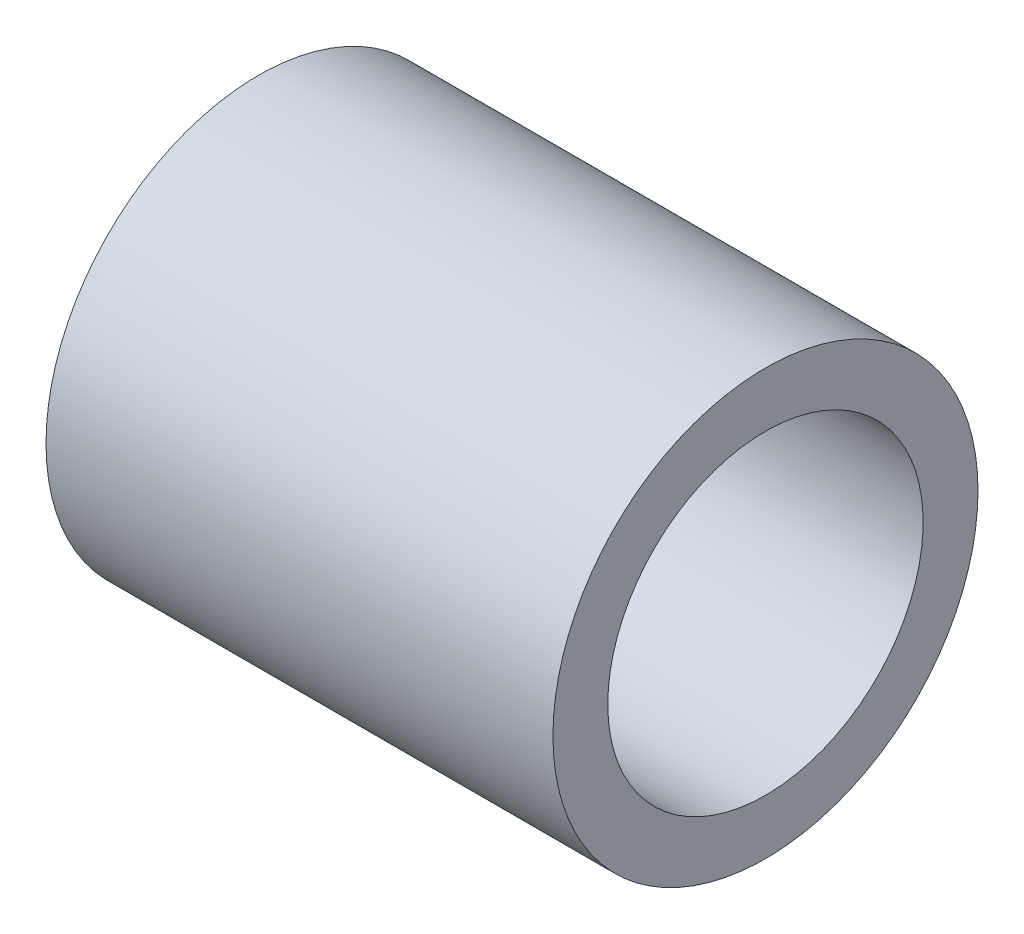
ISO-10303-21;
HEADER;
FILE_DESCRIPTION(('STEP AP214'),'2;1');
FILE_NAME('part.step','',(''),(''),'','','');
FILE_SCHEMA(('AUTOMOTIVE_DESIGN { 1 0 10303 214 1 1 1 1 }'));
ENDSEC;
DATA;
#1=APPLICATION_CONTEXT('core data for automotive mechanical design processes');
#2=APPLICATION_PROTOCOL_DEFINITION('international standard','automotive_design',2000,#1);
#3=PRODUCT_CONTEXT('',#1,'mechanical');
#4=PRODUCT('Part','Part','',(#3));
#5=PRODUCT_RELATED_PRODUCT_CATEGORY('part','',(#4));
#6=PRODUCT_DEFINITION_FORMATION('','',#4);
#7=PRODUCT_DEFINITION_CONTEXT('part definition',#1,'design');
#8=PRODUCT_DEFINITION('design','',#6,#7);
#9=PRODUCT_DEFINITION_SHAPE('','',#8);
#10=(LENGTH_UNIT() NAMED_UNIT(*) SI_UNIT(.MILLI.,.METRE.));
#11=(NAMED_UNIT(*) PLANE_ANGLE_UNIT() SI_UNIT($,.RADIAN.));
#12=(NAMED_UNIT(*) SI_UNIT($,.STERADIAN.) SOLID_ANGLE_UNIT());
#13=UNCERTAINTY_MEASURE_WITH_UNIT(LENGTH_MEASURE(1.E-05),#10,'distance_accuracy_value','');
#14=(GEOMETRIC_REPRESENTATION_CONTEXT(3) GLOBAL_UNCERTAINTY_ASSIGNED_CONTEXT((#13)) GLOBAL_UNIT_ASSIGNED_CONTEXT((#10,
#11,#12)) REPRESENTATION_CONTEXT('',''));
#15=CARTESIAN_POINT('',(0.,0.,0.));
#16=DIRECTION('',(0.,0.,1.));
#17=DIRECTION('',(1.,0.,0.));
#18=AXIS2_PLACEMENT_3D('',#15,#16,#17);
#19=CARTESIAN_POINT('',(25.4,-3.88578058618805E-13,-2.22044604925031E-13));
#20=DIRECTION('',(0.999999999999997,0.,0.));
#21=DIRECTION('',(0.,0.,-0.99999999999999));
#22=AXIS2_PLACEMENT_3D('',#19,#20,#21);
#23=PLANE('',#22);
#24=CARTESIAN_POINT('',(25.4,-3.88578058618805E-13,-2.22044604925031E-13));
#25=DIRECTION('',(0.999999999999997,0.,0.));
#26=DIRECTION('',(0.,0.,-0.99999999999999));
#27=AXIS2_PLACEMENT_3D('',#24,#25,#26);
#28=CIRCLE('',#27,10.65);
#29=CARTESIAN_POINT('',(25.4,-3.88578058618805E-13,10.6499999999997));
#30=VERTEX_POINT('',#29);
#31=EDGE_CURVE('E10',#30,#30,#28,.T.);
#32=ORIENTED_EDGE('',*,*,#31,.T.);
#33=EDGE_LOOP('',(#32));
#34=FACE_BOUND('',#33,.T.);
#35=CARTESIAN_POINT('',(25.4,-3.88578058618805E-13,-2.22044604925031E-13));
#36=DIRECTION('',(0.999999999999997,0.,0.));
#37=DIRECTION('',(0.,0.,-0.99999999999999));
#38=AXIS2_PLACEMENT_3D('',#35,#36,#37);
#39=CIRCLE('',#38,7.9);
#40=CARTESIAN_POINT('',(25.4,-3.88578058618805E-13,7.8999999999997));
#41=VERTEX_POINT('',#40);
#42=EDGE_CURVE('E39',#41,#41,#39,.T.);
#43=ORIENTED_EDGE('',*,*,#42,.F.);
#44=EDGE_LOOP('',(#43));
#45=FACE_BOUND('',#44,.T.);
#46=ADVANCED_FACE('F28',(#34,#45),#23,.T.);
#47=CARTESIAN_POINT('',(0.,0.,0.));
#48=DIRECTION('',(0.999999999999997,0.,0.));
#49=DIRECTION('',(0.,0.,-0.99999999999999));
#50=AXIS2_PLACEMENT_3D('',#47,#48,#49);
#51=PLANE('',#50);
#52=CARTESIAN_POINT('',(0.,0.,0.));
#53=DIRECTION('',(0.999999999999997,0.,0.));
#54=DIRECTION('',(0.,0.,-0.99999999999999));
#55=AXIS2_PLACEMENT_3D('',#52,#53,#54);
#56=CIRCLE('',#55,10.65);
#57=CARTESIAN_POINT('',(0.,-3.88578058618805E-13,10.6499999999997));
#58=VERTEX_POINT('',#57);
#59=EDGE_CURVE('E32',#58,#58,#56,.T.);
#60=ORIENTED_EDGE('',*,*,#59,.F.);
#61=EDGE_LOOP('',(#60));
#62=FACE_BOUND('',#61,.T.);
#63=CARTESIAN_POINT('',(0.,0.,0.));
#64=DIRECTION('',(0.999999999999997,0.,0.));
#65=DIRECTION('',(0.,0.,-0.99999999999999));
#66=AXIS2_PLACEMENT_3D('',#63,#64,#65);
#67=CIRCLE('',#66,7.9);
#68=CARTESIAN_POINT('',(0.,-3.88578058618805E-13,7.8999999999997));
#69=VERTEX_POINT('',#68);
#70=EDGE_CURVE('E41',#69,#69,#67,.T.);
#71=ORIENTED_EDGE('',*,*,#70,.T.);
#72=EDGE_LOOP('',(#71));
#73=FACE_BOUND('',#72,.T.);
#74=ADVANCED_FACE('F51',(#62,#73),#51,.F.);
#75=CARTESIAN_POINT('',(25.4,-3.88578058618805E-13,-2.22044604925031E-13));
#76=DIRECTION('',(-0.999999999999997,0.,0.));
#77=DIRECTION('',(0.,0.,0.99999999999999));
#78=AXIS2_PLACEMENT_3D('',#75,#76,#77);
#79=CYLINDRICAL_SURFACE('',#78,10.65);
#80=CARTESIAN_POINT('',(25.4,-3.88578058618805E-13,10.6499999999997));
#81=CARTESIAN_POINT('',(25.1354166666666,-3.88578058618805E-13,10.6499999999997));
#82=CARTESIAN_POINT('',(24.8708333333333,-3.88578058618805E-13,10.6499999999997));
#83=CARTESIAN_POINT('',(24.3416666666666,-3.88578058618805E-13,10.6499999999997));
#84=CARTESIAN_POINT('',(24.0770833333333,-3.88578058618805E-13,10.6499999999997));
#85=CARTESIAN_POINT('',(23.5479166666666,-3.88578058618805E-13,10.6499999999997));
#86=CARTESIAN_POINT('',(23.2833333333333,-3.88578058618805E-13,10.6499999999997));
#87=CARTESIAN_POINT('',(22.7541666666666,-3.88578058618805E-13,10.6499999999997));
#88=CARTESIAN_POINT('',(22.4895833333333,-3.88578058618805E-13,10.6499999999997));
#89=CARTESIAN_POINT('',(21.9604166666666,-3.88578058618805E-13,10.6499999999997));
#90=CARTESIAN_POINT('',(21.6958333333333,-3.88578058618805E-13,10.6499999999997));
#91=CARTESIAN_POINT('',(21.1666666666666,-3.88578058618805E-13,10.6499999999997));
#92=CARTESIAN_POINT('',(20.9020833333333,-3.88578058618805E-13,10.6499999999997));
#93=CARTESIAN_POINT('',(20.3729166666666,-3.88578058618805E-13,10.6499999999997));
#94=CARTESIAN_POINT('',(20.1083333333333,-3.88578058618805E-13,10.6499999999997));
#95=CARTESIAN_POINT('',(19.5791666666666,-3.88578058618805E-13,10.6499999999997));
#96=CARTESIAN_POINT('',(19.3145833333333,-3.88578058618805E-13,10.6499999999997));
#97=CARTESIAN_POINT('',(18.7854166666666,-3.88578058618805E-13,10.6499999999997));
#98=CARTESIAN_POINT('',(18.5208333333333,-3.88578058618805E-13,10.6499999999997));
#99=CARTESIAN_POINT('',(17.9916666666666,-3.88578058618805E-13,10.6499999999997));
#100=CARTESIAN_POINT('',(17.7270833333333,-3.88578058618805E-13,10.6499999999997));
#101=CARTESIAN_POINT('',(17.1979166666666,-3.88578058618805E-13,10.6499999999997));
#102=CARTESIAN_POINT('',(16.9333333333333,-3.88578058618805E-13,10.6499999999997));
#103=CARTESIAN_POINT('',(16.4041666666666,-3.88578058618805E-13,10.6499999999997));
#104=CARTESIAN_POINT('',(16.1395833333333,-3.88578058618805E-13,10.6499999999997));
#105=CARTESIAN_POINT('',(15.6104166666666,-3.88578058618805E-13,10.6499999999997));
#106=CARTESIAN_POINT('',(15.3458333333333,-3.88578058618805E-13,10.6499999999997));
#107=CARTESIAN_POINT('',(14.8166666666666,-3.88578058618805E-13,10.6499999999997));
#108=CARTESIAN_POINT('',(14.5520833333333,-3.88578058618805E-13,10.6499999999997));
#109=CARTESIAN_POINT('',(14.0229166666666,-3.88578058618805E-13,10.6499999999997));
#110=CARTESIAN_POINT('',(13.7583333333333,-3.88578058618805E-13,10.6499999999997));
#111=CARTESIAN_POINT('',(13.2291666666667,-3.88578058618805E-13,10.6499999999997));
#112=CARTESIAN_POINT('',(12.9645833333333,-3.88578058618805E-13,10.6499999999997));
#113=CARTESIAN_POINT('',(12.4354166666667,-3.88578058618805E-13,10.6499999999997));
#114=CARTESIAN_POINT('',(12.1708333333333,-3.88578058618805E-13,10.6499999999997));
#115=CARTESIAN_POINT('',(11.6416666666667,-3.88578058618805E-13,10.6499999999997));
#116=CARTESIAN_POINT('',(11.3770833333333,-3.88578058618805E-13,10.6499999999997));
#117=CARTESIAN_POINT('',(10.8479166666667,-3.88578058618805E-13,10.6499999999997));
#118=CARTESIAN_POINT('',(10.5833333333333,-3.88578058618805E-13,10.6499999999997));
#119=CARTESIAN_POINT('',(10.0541666666667,-3.88578058618805E-13,10.6499999999997));
#120=CARTESIAN_POINT('',(9.78958333333332,-3.88578058618805E-13,10.6499999999997));
#121=CARTESIAN_POINT('',(9.26041666666665,-3.88578058618805E-13,10.6499999999997));
#122=CARTESIAN_POINT('',(8.99583333333332,-3.88578058618805E-13,10.6499999999997));
#123=CARTESIAN_POINT('',(8.46666666666665,-3.88578058618805E-13,10.6499999999997));
#124=CARTESIAN_POINT('',(8.20208333333332,-3.88578058618805E-13,10.6499999999997));
#125=CARTESIAN_POINT('',(7.67291666666666,-3.88578058618805E-13,10.6499999999997));
#126=CARTESIAN_POINT('',(7.40833333333332,-3.88578058618805E-13,10.6499999999997));
#127=CARTESIAN_POINT('',(6.87916666666665,-3.88578058618805E-13,10.6499999999997));
#128=CARTESIAN_POINT('',(6.61458333333332,-3.88578058618805E-13,10.6499999999997));
#129=CARTESIAN_POINT('',(6.08541666666666,-3.88578058618805E-13,10.6499999999997));
#130=CARTESIAN_POINT('',(5.82083333333332,-3.88578058618805E-13,10.6499999999997));
#131=CARTESIAN_POINT('',(5.29166666666666,-3.88578058618805E-13,10.6499999999997));
#132=CARTESIAN_POINT('',(5.02708333333332,-3.88578058618805E-13,10.6499999999997));
#133=CARTESIAN_POINT('',(4.49791666666666,-3.88578058618805E-13,10.6499999999997));
#134=CARTESIAN_POINT('',(4.23333333333332,-3.88578058618805E-13,10.6499999999997));
#135=CARTESIAN_POINT('',(3.70416666666666,-3.88578058618805E-13,10.6499999999997));
#136=CARTESIAN_POINT('',(3.43958333333333,-3.88578058618805E-13,10.6499999999997));
#137=CARTESIAN_POINT('',(2.91041666666666,-3.88578058618805E-13,10.6499999999997));
#138=CARTESIAN_POINT('',(2.64583333333333,-3.88578058618805E-13,10.6499999999997));
#139=CARTESIAN_POINT('',(2.11666666666666,-3.88578058618805E-13,10.6499999999997));
#140=CARTESIAN_POINT('',(1.85208333333333,-3.88578058618805E-13,10.6499999999997));
#141=CARTESIAN_POINT('',(1.32291666666666,-3.88578058618805E-13,10.6499999999997));
#142=CARTESIAN_POINT('',(1.05833333333333,-3.88578058618805E-13,10.6499999999997));
#143=CARTESIAN_POINT('',(0.529166666666663,-3.88578058618805E-13,10.6499999999997));
#144=CARTESIAN_POINT('',(0.26458333333333,-3.88578058618805E-13,10.6499999999997));
#145=CARTESIAN_POINT('',(0.,-3.88578058618805E-13,10.6499999999997));
#146=B_SPLINE_CURVE_WITH_KNOTS('',3,(#80,#81,#82,#83,#84,#85,#86,#87,#88,#89,#90,#91,#92,#93,
#94,#95,#96,#97,#98,#99,#100,#101,#102,#103,#104,#105,#106,#107,#108,#109,#110,#111,#112,#113,
#114,#115,#116,#117,#118,#119,#120,#121,#122,#123,#124,#125,#126,#127,#128,#129,#130,#131,#132,
#133,#134,#135,#136,#137,#138,#139,#140,#141,#142,#143,#144,#145),.UNSPECIFIED.,.F.,.F.,(4,2,2,
2,2,2,2,2,2,2,2,2,2,2,2,2,2,2,2,2,2,2,2,2,2,2,2,2,2,2,2,2,4),(0.,0.793749999999996,1.5875,
2.38124999999999,3.17499999999999,3.96874999999999,4.76249999999999,5.55624999999999,
6.34999999999999,7.14374999999999,7.93749999999999,8.73124999999999,9.52499999999999,10.31875,
11.1125,11.90625,12.7,13.49375,14.2875,15.08125,15.875,16.66875,17.4625,18.25625,19.05,19.84375,
20.6375,21.43125,22.225,23.01875,23.8125,24.60625,25.4),.UNSPECIFIED.);
#147=EDGE_CURVE('BSEAM30',#30,#58,#146,.T.);
#148=ORIENTED_EDGE('',*,*,#31,.F.);
#149=ORIENTED_EDGE('',*,*,#59,.T.);
#150=ORIENTED_EDGE('',*,*,#147,.T.);
#151=ORIENTED_EDGE('',*,*,#147,.F.);
#152=EDGE_LOOP('',(#148,#150,#149,#151));
#153=FACE_BOUND('',#152,.T.);
#154=ADVANCED_FACE('F30',(#153),#79,.T.);
#155=CARTESIAN_POINT('',(25.4,-3.88578058618805E-13,-2.22044604925031E-13));
#156=DIRECTION('',(-0.999999999999997,0.,0.));
#157=DIRECTION('',(0.,0.,0.99999999999999));
#158=AXIS2_PLACEMENT_3D('',#155,#156,#157);
#159=CYLINDRICAL_SURFACE('',#158,7.9);
#160=CARTESIAN_POINT('',(25.4,-3.88578058618805E-13,7.8999999999997));
#161=CARTESIAN_POINT('',(25.1354166666666,-3.88578058618805E-13,7.8999999999997));
#162=CARTESIAN_POINT('',(24.8708333333333,-3.88578058618805E-13,7.8999999999997));
#163=CARTESIAN_POINT('',(24.3416666666666,-3.88578058618805E-13,7.8999999999997));
#164=CARTESIAN_POINT('',(24.0770833333333,-3.88578058618805E-13,7.8999999999997));
#165=CARTESIAN_POINT('',(23.5479166666666,-3.88578058618805E-13,7.8999999999997));
#166=CARTESIAN_POINT('',(23.2833333333333,-3.88578058618805E-13,7.8999999999997));
#167=CARTESIAN_POINT('',(22.7541666666666,-3.88578058618805E-13,7.8999999999997));
#168=CARTESIAN_POINT('',(22.4895833333333,-3.88578058618805E-13,7.8999999999997));
#169=CARTESIAN_POINT('',(21.9604166666666,-3.88578058618805E-13,7.8999999999997));
#170=CARTESIAN_POINT('',(21.6958333333333,-3.88578058618805E-13,7.8999999999997));
#171=CARTESIAN_POINT('',(21.1666666666666,-3.88578058618805E-13,7.8999999999997));
#172=CARTESIAN_POINT('',(20.9020833333333,-3.88578058618805E-13,7.8999999999997));
#173=CARTESIAN_POINT('',(20.3729166666666,-3.88578058618805E-13,7.8999999999997));
#174=CARTESIAN_POINT('',(20.1083333333333,-3.88578058618805E-13,7.8999999999997));
#175=CARTESIAN_POINT('',(19.5791666666666,-3.88578058618805E-13,7.8999999999997));
#176=CARTESIAN_POINT('',(19.3145833333333,-3.88578058618805E-13,7.8999999999997));
#177=CARTESIAN_POINT('',(18.7854166666666,-3.88578058618805E-13,7.8999999999997));
#178=CARTESIAN_POINT('',(18.5208333333333,-3.88578058618805E-13,7.8999999999997));
#179=CARTESIAN_POINT('',(17.9916666666666,-3.88578058618805E-13,7.8999999999997));
#180=CARTESIAN_POINT('',(17.7270833333333,-3.88578058618805E-13,7.8999999999997));
#181=CARTESIAN_POINT('',(17.1979166666666,-3.88578058618805E-13,7.8999999999997));
#182=CARTESIAN_POINT('',(16.9333333333333,-3.88578058618805E-13,7.8999999999997));
#183=CARTESIAN_POINT('',(16.4041666666666,-3.88578058618805E-13,7.8999999999997));
#184=CARTESIAN_POINT('',(16.1395833333333,-3.88578058618805E-13,7.8999999999997));
#185=CARTESIAN_POINT('',(15.6104166666666,-3.88578058618805E-13,7.8999999999997));
#186=CARTESIAN_POINT('',(15.3458333333333,-3.88578058618805E-13,7.8999999999997));
#187=CARTESIAN_POINT('',(14.8166666666666,-3.88578058618805E-13,7.8999999999997));
#188=CARTESIAN_POINT('',(14.5520833333333,-3.88578058618805E-13,7.8999999999997));
#189=CARTESIAN_POINT('',(14.0229166666666,-3.88578058618805E-13,7.8999999999997));
#190=CARTESIAN_POINT('',(13.7583333333333,-3.88578058618805E-13,7.8999999999997));
#191=CARTESIAN_POINT('',(13.2291666666667,-3.88578058618805E-13,7.8999999999997));
#192=CARTESIAN_POINT('',(12.9645833333333,-3.88578058618805E-13,7.8999999999997));
#193=CARTESIAN_POINT('',(12.4354166666667,-3.88578058618805E-13,7.8999999999997));
#194=CARTESIAN_POINT('',(12.1708333333333,-3.88578058618805E-13,7.8999999999997));
#195=CARTESIAN_POINT('',(11.6416666666667,-3.88578058618805E-13,7.8999999999997));
#196=CARTESIAN_POINT('',(11.3770833333333,-3.88578058618805E-13,7.8999999999997));
#197=CARTESIAN_POINT('',(10.8479166666667,-3.88578058618805E-13,7.8999999999997));
#198=CARTESIAN_POINT('',(10.5833333333333,-3.88578058618805E-13,7.8999999999997));
#199=CARTESIAN_POINT('',(10.0541666666667,-3.88578058618805E-13,7.8999999999997));
#200=CARTESIAN_POINT('',(9.78958333333332,-3.88578058618805E-13,7.8999999999997));
#201=CARTESIAN_POINT('',(9.26041666666665,-3.88578058618805E-13,7.8999999999997));
#202=CARTESIAN_POINT('',(8.99583333333332,-3.88578058618805E-13,7.8999999999997));
#203=CARTESIAN_POINT('',(8.46666666666665,-3.88578058618805E-13,7.8999999999997));
#204=CARTESIAN_POINT('',(8.20208333333332,-3.88578058618805E-13,7.8999999999997));
#205=CARTESIAN_POINT('',(7.67291666666666,-3.88578058618805E-13,7.8999999999997));
#206=CARTESIAN_POINT('',(7.40833333333332,-3.88578058618805E-13,7.8999999999997));
#207=CARTESIAN_POINT('',(6.87916666666665,-3.88578058618805E-13,7.8999999999997));
#208=CARTESIAN_POINT('',(6.61458333333332,-3.88578058618805E-13,7.8999999999997));
#209=CARTESIAN_POINT('',(6.08541666666666,-3.88578058618805E-13,7.8999999999997));
#210=CARTESIAN_POINT('',(5.82083333333332,-3.88578058618805E-13,7.8999999999997));
#211=CARTESIAN_POINT('',(5.29166666666666,-3.88578058618805E-13,7.8999999999997));
#212=CARTESIAN_POINT('',(5.02708333333332,-3.88578058618805E-13,7.8999999999997));
#213=CARTESIAN_POINT('',(4.49791666666666,-3.88578058618805E-13,7.8999999999997));
#214=CARTESIAN_POINT('',(4.23333333333332,-3.88578058618805E-13,7.8999999999997));
#215=CARTESIAN_POINT('',(3.70416666666666,-3.88578058618805E-13,7.8999999999997));
#216=CARTESIAN_POINT('',(3.43958333333333,-3.88578058618805E-13,7.8999999999997));
#217=CARTESIAN_POINT('',(2.91041666666666,-3.88578058618805E-13,7.8999999999997));
#218=CARTESIAN_POINT('',(2.64583333333333,-3.88578058618805E-13,7.8999999999997));
#219=CARTESIAN_POINT('',(2.11666666666666,-3.88578058618805E-13,7.8999999999997));
#220=CARTESIAN_POINT('',(1.85208333333333,-3.88578058618805E-13,7.8999999999997));
#221=CARTESIAN_POINT('',(1.32291666666666,-3.88578058618805E-13,7.8999999999997));
#222=CARTESIAN_POINT('',(1.05833333333333,-3.88578058618805E-13,7.8999999999997));
#223=CARTESIAN_POINT('',(0.529166666666663,-3.88578058618805E-13,7.8999999999997));
#224=CARTESIAN_POINT('',(0.26458333333333,-3.88578058618805E-13,7.8999999999997));
#225=CARTESIAN_POINT('',(0.,-3.88578058618805E-13,7.8999999999997));
#226=B_SPLINE_CURVE_WITH_KNOTS('',3,(#160,#161,#162,#163,#164,#165,#166,#167,#168,#169,#170,
#171,#172,#173,#174,#175,#176,#177,#178,#179,#180,#181,#182,#183,#184,#185,#186,#187,#188,#189,
#190,#191,#192,#193,#194,#195,#196,#197,#198,#199,#200,#201,#202,#203,#204,#205,#206,#207,#208,
#209,#210,#211,#212,#213,#214,#215,#216,#217,#218,#219,#220,#221,#222,#223,#224,#225),
.UNSPECIFIED.,.F.,.F.,(4,2,2,2,2,2,2,2,2,2,2,2,2,2,2,2,2,2,2,2,2,2,2,2,2,2,2,2,2,2,2,2,4),(0.,
0.793749999999996,1.5875,2.38124999999999,3.17499999999999,3.96874999999999,4.76249999999999,
5.55624999999999,6.34999999999999,7.14374999999999,7.93749999999999,8.73124999999999,
9.52499999999999,10.31875,11.1125,11.90625,12.7,13.49375,14.2875,15.08125,15.875,16.66875,
17.4625,18.25625,19.05,19.84375,20.6375,21.43125,22.225,23.01875,23.8125,24.60625,25.4),.UNSPECIFIED.);
#227=EDGE_CURVE('BSEAM47',#41,#69,#226,.T.);
#228=ORIENTED_EDGE('',*,*,#42,.T.);
#229=ORIENTED_EDGE('',*,*,#70,.F.);
#230=ORIENTED_EDGE('',*,*,#227,.T.);
#231=ORIENTED_EDGE('',*,*,#227,.F.);
#232=EDGE_LOOP('',(#228,#230,#229,#231));
#233=FACE_BOUND('',#232,.T.);
#234=ADVANCED_FACE('F47',(#233),#159,.F.);
#235=CLOSED_SHELL('',(#46,#74,#154,#234));
#236=MANIFOLD_SOLID_BREP('B2',#235);
#237=ADVANCED_BREP_SHAPE_REPRESENTATION('',(#18,#236),#14);
#238=SHAPE_DEFINITION_REPRESENTATION(#9,#237);
ENDSEC;
END-ISO-10303-21;
